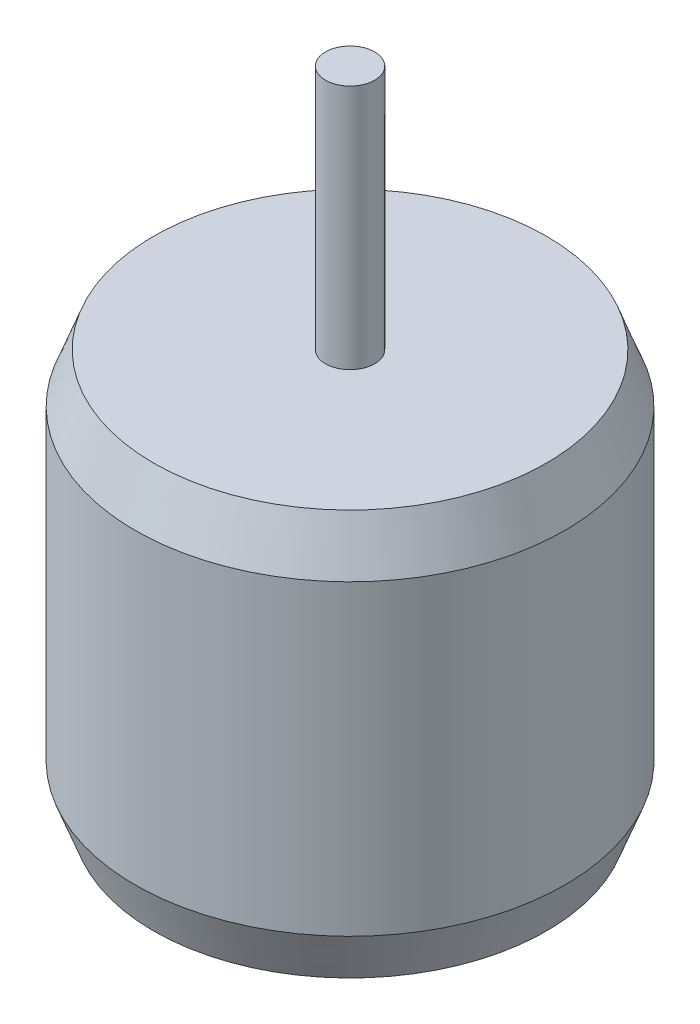
ISO-10303-21;
HEADER;
FILE_DESCRIPTION(('STEP AP214'),'2;1');
FILE_NAME('part.step','',(''),(''),'','','');
FILE_SCHEMA(('AUTOMOTIVE_DESIGN { 1 0 10303 214 1 1 1 1 }'));
ENDSEC;
DATA;
#1=APPLICATION_CONTEXT('core data for automotive mechanical design processes');
#2=APPLICATION_PROTOCOL_DEFINITION('international standard','automotive_design',2000,#1);
#3=PRODUCT_CONTEXT('',#1,'mechanical');
#4=PRODUCT('Part','Part','',(#3));
#5=PRODUCT_RELATED_PRODUCT_CATEGORY('part','',(#4));
#6=PRODUCT_DEFINITION_FORMATION('','',#4);
#7=PRODUCT_DEFINITION_CONTEXT('part definition',#1,'design');
#8=PRODUCT_DEFINITION('design','',#6,#7);
#9=PRODUCT_DEFINITION_SHAPE('','',#8);
#10=(LENGTH_UNIT() NAMED_UNIT(*) SI_UNIT(.MILLI.,.METRE.));
#11=(NAMED_UNIT(*) PLANE_ANGLE_UNIT() SI_UNIT($,.RADIAN.));
#12=(NAMED_UNIT(*) SI_UNIT($,.STERADIAN.) SOLID_ANGLE_UNIT());
#13=UNCERTAINTY_MEASURE_WITH_UNIT(LENGTH_MEASURE(1.E-05),#10,'distance_accuracy_value','');
#14=(GEOMETRIC_REPRESENTATION_CONTEXT(3) GLOBAL_UNCERTAINTY_ASSIGNED_CONTEXT((#13)) GLOBAL_UNIT_ASSIGNED_CONTEXT((#10,
#11,#12)) REPRESENTATION_CONTEXT('',''));
#15=CARTESIAN_POINT('',(0.,0.,0.));
#16=DIRECTION('',(0.,0.,1.));
#17=DIRECTION('',(1.,0.,0.));
#18=AXIS2_PLACEMENT_3D('',#15,#16,#17);
#19=CARTESIAN_POINT('',(0.,0.,0.));
#20=DIRECTION('',(0.,-1.,0.));
#21=DIRECTION('',(0.,0.,-1.));
#22=AXIS2_PLACEMENT_3D('',#19,#20,#21);
#23=PLANE('',#22);
#24=CARTESIAN_POINT('',(0.,0.,0.));
#25=DIRECTION('',(0.,-1.,0.));
#26=DIRECTION('',(0.,0.,-1.));
#27=AXIS2_PLACEMENT_3D('',#24,#25,#26);
#28=CIRCLE('',#27,2.);
#29=CARTESIAN_POINT('',(0.,0.,-2.));
#30=VERTEX_POINT('',#29);
#31=EDGE_CURVE('E10',#30,#30,#28,.T.);
#32=ORIENTED_EDGE('',*,*,#31,.F.);
#33=EDGE_LOOP('',(#32));
#34=FACE_BOUND('',#33,.T.);
#35=ADVANCED_FACE('F35',(#34),#23,.F.);
#36=CARTESIAN_POINT('',(0.,-55.,0.));
#37=DIRECTION('',(0.,-1.,0.));
#38=DIRECTION('',(0.,0.,-1.));
#39=AXIS2_PLACEMENT_3D('',#36,#37,#38);
#40=CYLINDRICAL_SURFACE('',#39,2.);
#41=CARTESIAN_POINT('',(0.,-20.,0.));
#42=DIRECTION('',(0.,-1.,0.));
#43=DIRECTION('',(0.,0.,-1.));
#44=AXIS2_PLACEMENT_3D('',#41,#42,#43);
#45=CIRCLE('',#44,2.);
#46=CARTESIAN_POINT('',(0.,-20.,-2.));
#47=VERTEX_POINT('',#46);
#48=EDGE_CURVE('E41',#47,#47,#45,.T.);
#49=ORIENTED_EDGE('',*,*,#48,.F.);
#50=EDGE_LOOP('',(#49));
#51=FACE_BOUND('',#50,.T.);
#52=ORIENTED_EDGE('',*,*,#31,.T.);
#53=EDGE_LOOP('',(#52));
#54=FACE_BOUND('',#53,.T.);
#55=ADVANCED_FACE('F101',(#51,#54),#40,.T.);
#56=CARTESIAN_POINT('',(0.,-20.,2.));
#57=DIRECTION('',(0.,-1.,0.));
#58=DIRECTION('',(0.,0.,-1.));
#59=AXIS2_PLACEMENT_3D('',#56,#57,#58);
#60=PLANE('',#59);
#61=CARTESIAN_POINT('',(0.,-20.,0.));
#62=DIRECTION('',(0.,-1.,0.));
#63=DIRECTION('',(0.,0.,-1.));
#64=AXIS2_PLACEMENT_3D('',#61,#62,#63);
#65=CIRCLE('',#64,16.);
#66=CARTESIAN_POINT('',(0.,-20.,-16.));
#67=VERTEX_POINT('',#66);
#68=EDGE_CURVE('E45',#67,#67,#65,.T.);
#69=ORIENTED_EDGE('',*,*,#68,.F.);
#70=EDGE_LOOP('',(#69));
#71=FACE_BOUND('',#70,.T.);
#72=ORIENTED_EDGE('',*,*,#48,.T.);
#73=EDGE_LOOP('',(#72));
#74=FACE_BOUND('',#73,.T.);
#75=ADVANCED_FACE('F96',(#71,#74),#60,.F.);
#76=CARTESIAN_POINT('',(0.,-20.,0.));
#77=DIRECTION('',(0.,-1.,0.));
#78=DIRECTION('',(0.,0.,-1.));
#79=AXIS2_PLACEMENT_3D('',#76,#77,#78);
#80=CONICAL_SURFACE('',#79,16.,0.358770670270572);
#81=CARTESIAN_POINT('',(0.,-24.,0.));
#82=DIRECTION('',(0.,-1.,0.));
#83=DIRECTION('',(0.,0.,-1.));
#84=AXIS2_PLACEMENT_3D('',#81,#82,#83);
#85=CIRCLE('',#84,17.5);
#86=CARTESIAN_POINT('',(0.,-24.,-17.5));
#87=VERTEX_POINT('',#86);
#88=EDGE_CURVE('E49',#87,#87,#85,.T.);
#89=ORIENTED_EDGE('',*,*,#88,.F.);
#90=EDGE_LOOP('',(#89));
#91=FACE_BOUND('',#90,.T.);
#92=ORIENTED_EDGE('',*,*,#68,.T.);
#93=EDGE_LOOP('',(#92));
#94=FACE_BOUND('',#93,.T.);
#95=ADVANCED_FACE('F90',(#91,#94),#80,.T.);
#96=CARTESIAN_POINT('',(0.,-55.,0.));
#97=DIRECTION('',(0.,-1.,0.));
#98=DIRECTION('',(0.,0.,-1.));
#99=AXIS2_PLACEMENT_3D('',#96,#97,#98);
#100=CYLINDRICAL_SURFACE('',#99,17.5);
#101=CARTESIAN_POINT('',(0.,-49.,0.));
#102=DIRECTION('',(0.,-1.,0.));
#103=DIRECTION('',(0.,0.,-1.));
#104=AXIS2_PLACEMENT_3D('',#101,#102,#103);
#105=CIRCLE('',#104,17.5);
#106=CARTESIAN_POINT('',(0.,-49.,-17.5));
#107=VERTEX_POINT('',#106);
#108=EDGE_CURVE('E54',#107,#107,#105,.T.);
#109=ORIENTED_EDGE('',*,*,#108,.F.);
#110=EDGE_LOOP('',(#109));
#111=FACE_BOUND('',#110,.T.);
#112=ORIENTED_EDGE('',*,*,#88,.T.);
#113=EDGE_LOOP('',(#112));
#114=FACE_BOUND('',#113,.T.);
#115=ADVANCED_FACE('F84',(#111,#114),#100,.T.);
#116=CARTESIAN_POINT('',(0.,-49.,0.));
#117=DIRECTION('',(0.,1.,0.));
#118=DIRECTION('',(0.,0.,1.));
#119=AXIS2_PLACEMENT_3D('',#116,#117,#118);
#120=CONICAL_SURFACE('',#119,17.5,0.358770670270572);
#121=CARTESIAN_POINT('',(0.,-53.,0.));
#122=DIRECTION('',(0.,-1.,0.));
#123=DIRECTION('',(0.,0.,-1.));
#124=AXIS2_PLACEMENT_3D('',#121,#122,#123);
#125=CIRCLE('',#124,16.);
#126=CARTESIAN_POINT('',(0.,-53.,-16.));
#127=VERTEX_POINT('',#126);
#128=EDGE_CURVE('E57',#127,#127,#125,.T.);
#129=ORIENTED_EDGE('',*,*,#128,.F.);
#130=EDGE_LOOP('',(#129));
#131=FACE_BOUND('',#130,.T.);
#132=ORIENTED_EDGE('',*,*,#108,.T.);
#133=EDGE_LOOP('',(#132));
#134=FACE_BOUND('',#133,.T.);
#135=ADVANCED_FACE('F78',(#131,#134),#120,.T.);
#136=CARTESIAN_POINT('',(0.,-53.,16.));
#137=DIRECTION('',(0.,1.,0.));
#138=DIRECTION('',(0.,0.,1.));
#139=AXIS2_PLACEMENT_3D('',#136,#137,#138);
#140=PLANE('',#139);
#141=CARTESIAN_POINT('',(0.,-53.,0.));
#142=DIRECTION('',(0.,-1.,0.));
#143=DIRECTION('',(0.,0.,-1.));
#144=AXIS2_PLACEMENT_3D('',#141,#142,#143);
#145=CIRCLE('',#144,6.);
#146=CARTESIAN_POINT('',(0.,-53.,-6.));
#147=VERTEX_POINT('',#146);
#148=EDGE_CURVE('E60',#147,#147,#145,.T.);
#149=ORIENTED_EDGE('',*,*,#148,.F.);
#150=EDGE_LOOP('',(#149));
#151=FACE_BOUND('',#150,.T.);
#152=ORIENTED_EDGE('',*,*,#128,.T.);
#153=EDGE_LOOP('',(#152));
#154=FACE_BOUND('',#153,.T.);
#155=ADVANCED_FACE('F72',(#151,#154),#140,.F.);
#156=CARTESIAN_POINT('',(0.,-55.,0.));
#157=DIRECTION('',(0.,-1.,0.));
#158=DIRECTION('',(0.,0.,-1.));
#159=AXIS2_PLACEMENT_3D('',#156,#157,#158);
#160=CYLINDRICAL_SURFACE('',#159,6.);
#161=CARTESIAN_POINT('',(0.,-55.,0.));
#162=DIRECTION('',(0.,-1.,0.));
#163=DIRECTION('',(0.,0.,-1.));
#164=AXIS2_PLACEMENT_3D('',#161,#162,#163);
#165=CIRCLE('',#164,6.);
#166=CARTESIAN_POINT('',(0.,-55.,-6.));
#167=VERTEX_POINT('',#166);
#168=EDGE_CURVE('E63',#167,#167,#165,.T.);
#169=ORIENTED_EDGE('',*,*,#168,.F.);
#170=EDGE_LOOP('',(#169));
#171=FACE_BOUND('',#170,.T.);
#172=ORIENTED_EDGE('',*,*,#148,.T.);
#173=EDGE_LOOP('',(#172));
#174=FACE_BOUND('',#173,.T.);
#175=ADVANCED_FACE('F69',(#171,#174),#160,.T.);
#176=CARTESIAN_POINT('',(0.,-55.,6.));
#177=DIRECTION('',(0.,1.,0.));
#178=DIRECTION('',(0.,0.,1.));
#179=AXIS2_PLACEMENT_3D('',#176,#177,#178);
#180=PLANE('',#179);
#181=ORIENTED_EDGE('',*,*,#168,.T.);
#182=EDGE_LOOP('',(#181));
#183=FACE_BOUND('',#182,.T.);
#184=ADVANCED_FACE('F67',(#183),#180,.F.);
#185=CLOSED_SHELL('',(#35,#55,#75,#95,#115,#135,#155,#175,#184));
#186=MANIFOLD_SOLID_BREP('B2',#185);
#187=ADVANCED_BREP_SHAPE_REPRESENTATION('',(#18,#186),#14);
#188=SHAPE_DEFINITION_REPRESENTATION(#9,#187);
ENDSEC;
END-ISO-10303-21;
